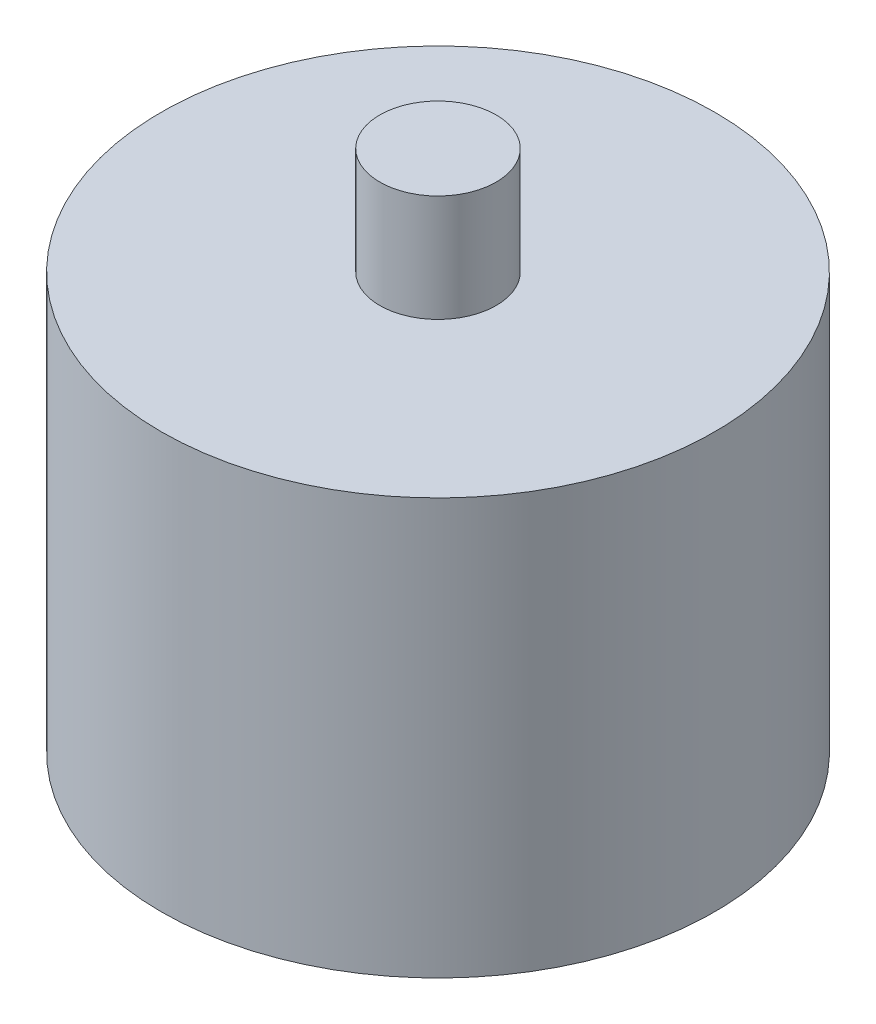
ISO-10303-21;
HEADER;
FILE_DESCRIPTION(('STEP AP214'),'2;1');
FILE_NAME('part.step','',(''),(''),'','','');
FILE_SCHEMA(('AUTOMOTIVE_DESIGN { 1 0 10303 214 1 1 1 1 }'));
ENDSEC;
DATA;
#1=APPLICATION_CONTEXT('core data for automotive mechanical design processes');
#2=APPLICATION_PROTOCOL_DEFINITION('international standard','automotive_design',2000,#1);
#3=PRODUCT_CONTEXT('',#1,'mechanical');
#4=PRODUCT('Part','Part','',(#3));
#5=PRODUCT_RELATED_PRODUCT_CATEGORY('part','',(#4));
#6=PRODUCT_DEFINITION_FORMATION('','',#4);
#7=PRODUCT_DEFINITION_CONTEXT('part definition',#1,'design');
#8=PRODUCT_DEFINITION('design','',#6,#7);
#9=PRODUCT_DEFINITION_SHAPE('','',#8);
#10=(LENGTH_UNIT() NAMED_UNIT(*) SI_UNIT(.MILLI.,.METRE.));
#11=(NAMED_UNIT(*) PLANE_ANGLE_UNIT() SI_UNIT($,.RADIAN.));
#12=(NAMED_UNIT(*) SI_UNIT($,.STERADIAN.) SOLID_ANGLE_UNIT());
#13=UNCERTAINTY_MEASURE_WITH_UNIT(LENGTH_MEASURE(1.E-05),#10,'distance_accuracy_value','');
#14=(GEOMETRIC_REPRESENTATION_CONTEXT(3) GLOBAL_UNCERTAINTY_ASSIGNED_CONTEXT((#13)) GLOBAL_UNIT_ASSIGNED_CONTEXT((#10,
#11,#12)) REPRESENTATION_CONTEXT('',''));
#15=CARTESIAN_POINT('',(0.,0.,0.));
#16=DIRECTION('',(0.,0.,1.));
#17=DIRECTION('',(1.,0.,0.));
#18=AXIS2_PLACEMENT_3D('',#15,#16,#17);
#19=CARTESIAN_POINT('',(31.2213378517178,15.1416788722923,0.));
#20=DIRECTION('',(0.,-1.,0.));
#21=DIRECTION('',(0.,0.,-1.));
#22=AXIS2_PLACEMENT_3D('',#19,#20,#21);
#23=PLANE('',#22);
#24=CARTESIAN_POINT('',(0.,15.1416788722923,0.));
#25=DIRECTION('',(0.,-1.,0.));
#26=DIRECTION('',(0.,0.,-1.));
#27=AXIS2_PLACEMENT_3D('',#24,#25,#26);
#28=CIRCLE('',#27,31.2213378517178);
#29=CARTESIAN_POINT('',(0.,15.1416788722923,-31.2213378517178));
#30=VERTEX_POINT('',#29);
#31=EDGE_CURVE('E45',#30,#30,#28,.T.);
#32=ORIENTED_EDGE('',*,*,#31,.T.);
#33=EDGE_LOOP('',(#32));
#34=FACE_BOUND('',#33,.T.);
#35=ADVANCED_FACE('F31',(#34),#23,.T.);
#36=CARTESIAN_POINT('',(0.,74.100428463519,0.));
#37=DIRECTION('',(0.,1.,0.));
#38=DIRECTION('',(0.,0.,1.));
#39=AXIS2_PLACEMENT_3D('',#36,#37,#38);
#40=PLANE('',#39);
#41=CARTESIAN_POINT('',(0.,74.100428463519,0.));
#42=DIRECTION('',(0.,-1.,0.));
#43=DIRECTION('',(0.,0.,-1.));
#44=AXIS2_PLACEMENT_3D('',#41,#42,#43);
#45=CIRCLE('',#44,6.5658607499321);
#46=CARTESIAN_POINT('',(0.,74.100428463519,-6.5658607499321));
#47=VERTEX_POINT('',#46);
#48=EDGE_CURVE('E10',#47,#47,#45,.T.);
#49=ORIENTED_EDGE('',*,*,#48,.F.);
#50=EDGE_LOOP('',(#49));
#51=FACE_BOUND('',#50,.T.);
#52=ADVANCED_FACE('F63',(#51),#40,.T.);
#53=CARTESIAN_POINT('',(0.,0.,0.));
#54=DIRECTION('',(0.,-1.,0.));
#55=DIRECTION('',(0.,0.,-1.));
#56=AXIS2_PLACEMENT_3D('',#53,#54,#55);
#57=CYLINDRICAL_SURFACE('',#56,6.5658607499321);
#58=ORIENTED_EDGE('',*,*,#48,.T.);
#59=EDGE_LOOP('',(#58));
#60=FACE_BOUND('',#59,.T.);
#61=CARTESIAN_POINT('',(0.,62.0406842289499,0.));
#62=DIRECTION('',(0.,-1.,0.));
#63=DIRECTION('',(0.,0.,-1.));
#64=AXIS2_PLACEMENT_3D('',#61,#62,#63);
#65=CIRCLE('',#64,6.5658607499321);
#66=CARTESIAN_POINT('',(0.,62.0406842289499,-6.5658607499321));
#67=VERTEX_POINT('',#66);
#68=EDGE_CURVE('E37',#67,#67,#65,.T.);
#69=ORIENTED_EDGE('',*,*,#68,.F.);
#70=EDGE_LOOP('',(#69));
#71=FACE_BOUND('',#70,.T.);
#72=ADVANCED_FACE('F60',(#60,#71),#57,.T.);
#73=CARTESIAN_POINT('',(31.2213378517178,62.0406842289499,0.));
#74=DIRECTION('',(0.,1.,0.));
#75=DIRECTION('',(0.,0.,1.));
#76=AXIS2_PLACEMENT_3D('',#73,#74,#75);
#77=PLANE('',#76);
#78=ORIENTED_EDGE('',*,*,#68,.T.);
#79=EDGE_LOOP('',(#78));
#80=FACE_BOUND('',#79,.T.);
#81=CARTESIAN_POINT('',(0.,62.0406842289499,0.));
#82=DIRECTION('',(0.,-1.,0.));
#83=DIRECTION('',(0.,0.,-1.));
#84=AXIS2_PLACEMENT_3D('',#81,#82,#83);
#85=CIRCLE('',#84,31.2213378517178);
#86=CARTESIAN_POINT('',(0.,62.0406842289499,-31.2213378517178));
#87=VERTEX_POINT('',#86);
#88=EDGE_CURVE('E41',#87,#87,#85,.T.);
#89=ORIENTED_EDGE('',*,*,#88,.F.);
#90=EDGE_LOOP('',(#89));
#91=FACE_BOUND('',#90,.T.);
#92=ADVANCED_FACE('F54',(#80,#91),#77,.T.);
#93=CARTESIAN_POINT('',(0.,0.,0.));
#94=DIRECTION('',(0.,-1.,0.));
#95=DIRECTION('',(0.,0.,-1.));
#96=AXIS2_PLACEMENT_3D('',#93,#94,#95);
#97=CYLINDRICAL_SURFACE('',#96,31.2213378517178);
#98=ORIENTED_EDGE('',*,*,#88,.T.);
#99=EDGE_LOOP('',(#98));
#100=FACE_BOUND('',#99,.T.);
#101=ORIENTED_EDGE('',*,*,#31,.F.);
#102=EDGE_LOOP('',(#101));
#103=FACE_BOUND('',#102,.T.);
#104=ADVANCED_FACE('F52',(#100,#103),#97,.T.);
#105=CLOSED_SHELL('',(#35,#52,#72,#92,#104));
#106=MANIFOLD_SOLID_BREP('B2',#105);
#107=ADVANCED_BREP_SHAPE_REPRESENTATION('',(#18,#106),#14);
#108=SHAPE_DEFINITION_REPRESENTATION(#9,#107);
ENDSEC;
END-ISO-10303-21;
